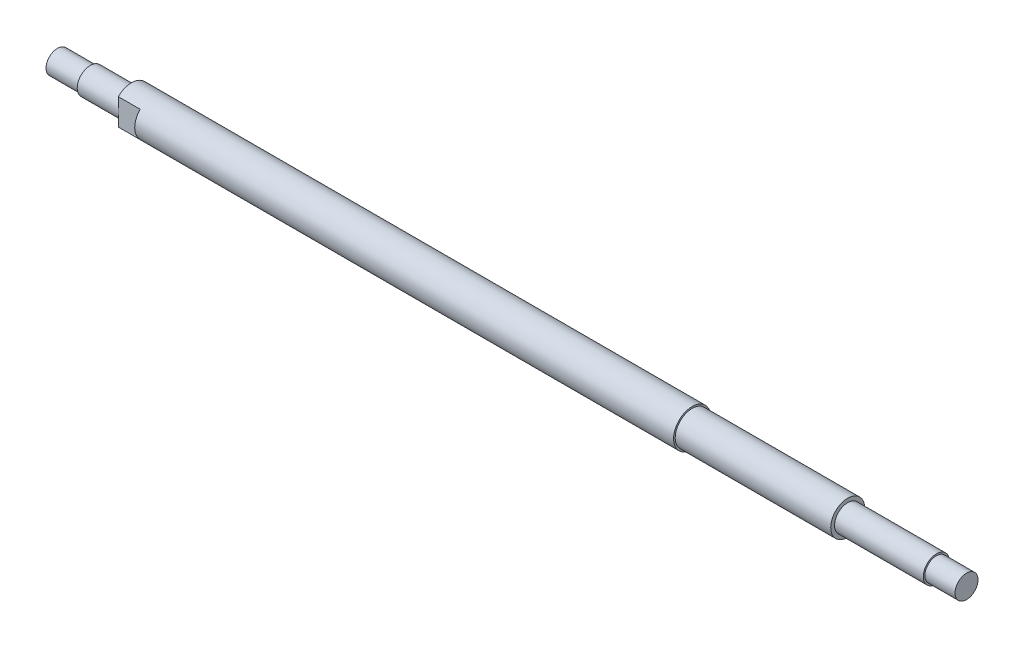
ISO-10303-21;
HEADER;
FILE_DESCRIPTION(('STEP AP214'),'2;1');
FILE_NAME('part.step','',(''),(''),'','','');
FILE_SCHEMA(('AUTOMOTIVE_DESIGN { 1 0 10303 214 1 1 1 1 }'));
ENDSEC;
DATA;
#1=APPLICATION_CONTEXT('core data for automotive mechanical design processes');
#2=APPLICATION_PROTOCOL_DEFINITION('international standard','automotive_design',2000,#1);
#3=PRODUCT_CONTEXT('',#1,'mechanical');
#4=PRODUCT('Part','Part','',(#3));
#5=PRODUCT_RELATED_PRODUCT_CATEGORY('part','',(#4));
#6=PRODUCT_DEFINITION_FORMATION('','',#4);
#7=PRODUCT_DEFINITION_CONTEXT('part definition',#1,'design');
#8=PRODUCT_DEFINITION('design','',#6,#7);
#9=PRODUCT_DEFINITION_SHAPE('','',#8);
#10=(LENGTH_UNIT() NAMED_UNIT(*) SI_UNIT(.MILLI.,.METRE.));
#11=(NAMED_UNIT(*) PLANE_ANGLE_UNIT() SI_UNIT($,.RADIAN.));
#12=(NAMED_UNIT(*) SI_UNIT($,.STERADIAN.) SOLID_ANGLE_UNIT());
#13=UNCERTAINTY_MEASURE_WITH_UNIT(LENGTH_MEASURE(1.E-05),#10,'distance_accuracy_value','');
#14=(GEOMETRIC_REPRESENTATION_CONTEXT(3) GLOBAL_UNCERTAINTY_ASSIGNED_CONTEXT((#13)) GLOBAL_UNIT_ASSIGNED_CONTEXT((#10,
#11,#12)) REPRESENTATION_CONTEXT('',''));
#15=CARTESIAN_POINT('',(0.,0.,0.));
#16=DIRECTION('',(0.,0.,1.));
#17=DIRECTION('',(1.,0.,0.));
#18=AXIS2_PLACEMENT_3D('',#15,#16,#17);
#19=CARTESIAN_POINT('',(7.5,0.,-2.4));
#20=DIRECTION('',(1.,0.,0.));
#21=DIRECTION('',(0.,0.,-1.));
#22=AXIS2_PLACEMENT_3D('',#19,#20,#21);
#23=PLANE('',#22);
#24=DIRECTION('',(0.,-1.,0.));
#25=VECTOR('',#24,1.);
#26=CARTESIAN_POINT('',(7.5,3.401,2.4));
#27=LINE('',#26,#25);
#28=CARTESIAN_POINT('',(7.5,2.40831891575846,2.4));
#29=VERTEX_POINT('',#28);
#30=CARTESIAN_POINT('',(7.5,0.,2.4));
#31=VERTEX_POINT('',#30);
#32=EDGE_CURVE('E86',#29,#31,#27,.T.);
#33=ORIENTED_EDGE('',*,*,#32,.F.);
#34=CARTESIAN_POINT('',(7.5,0.,0.));
#35=DIRECTION('',(-1.,0.,0.));
#36=DIRECTION('',(0.,0.,1.));
#37=AXIS2_PLACEMENT_3D('',#34,#35,#36);
#38=CIRCLE('',#37,3.4);
#39=CARTESIAN_POINT('',(7.5,2.40831891575846,-2.4));
#40=VERTEX_POINT('',#39);
#41=EDGE_CURVE('E108',#29,#40,#38,.T.);
#42=ORIENTED_EDGE('',*,*,#41,.T.);
#43=DIRECTION('',(0.,-1.,0.));
#44=VECTOR('',#43,1.);
#45=CARTESIAN_POINT('',(7.5,3.401,-2.4));
#46=LINE('',#45,#44);
#47=CARTESIAN_POINT('',(7.5,0.,-2.4));
#48=VERTEX_POINT('',#47);
#49=EDGE_CURVE('E138',#40,#48,#46,.T.);
#50=ORIENTED_EDGE('',*,*,#49,.T.);
#51=CARTESIAN_POINT('',(7.5,0.,0.));
#52=DIRECTION('',(-1.,0.,0.));
#53=DIRECTION('',(0.,0.,1.));
#54=AXIS2_PLACEMENT_3D('',#51,#52,#53);
#55=CIRCLE('',#54,2.4);
#56=EDGE_CURVE('E107',#31,#48,#55,.T.);
#57=ORIENTED_EDGE('',*,*,#56,.F.);
#58=EDGE_LOOP('',(#33,#42,#50,#57));
#59=FACE_BOUND('',#58,.T.);
#60=ADVANCED_FACE('F36',(#59),#23,.F.);
#61=CARTESIAN_POINT('',(7.5,-2.40831891575846,2.4));
#62=VERTEX_POINT('',#61);
#63=EDGE_CURVE('E83',#31,#62,#27,.T.);
#64=ORIENTED_EDGE('',*,*,#63,.F.);
#65=EDGE_CURVE('E110',#48,#31,#55,.T.);
#66=ORIENTED_EDGE('',*,*,#65,.F.);
#67=CARTESIAN_POINT('',(7.5,-2.40831891575846,-2.4));
#68=VERTEX_POINT('',#67);
#69=EDGE_CURVE('E106',#48,#68,#46,.T.);
#70=ORIENTED_EDGE('',*,*,#69,.T.);
#71=EDGE_CURVE('E99',#68,#62,#38,.T.);
#72=ORIENTED_EDGE('',*,*,#71,.T.);
#73=EDGE_LOOP('',(#64,#66,#70,#72));
#74=FACE_BOUND('',#73,.T.);
#75=ADVANCED_FACE('F104',(#74),#23,.F.);
#76=CARTESIAN_POINT('',(-12.2665012924017,0.,0.));
#77=DIRECTION('',(-1.,0.,0.));
#78=DIRECTION('',(0.,0.,1.));
#79=AXIS2_PLACEMENT_3D('',#76,#77,#78);
#80=CYLINDRICAL_SURFACE('',#79,3.4);
#81=CARTESIAN_POINT('',(109.9,0.,0.));
#82=DIRECTION('',(-1.,0.,0.));
#83=DIRECTION('',(0.,0.,1.));
#84=AXIS2_PLACEMENT_3D('',#81,#82,#83);
#85=CIRCLE('',#84,3.4);
#86=CARTESIAN_POINT('',(109.9,0.,3.4));
#87=VERTEX_POINT('',#86);
#88=EDGE_CURVE('E112',#87,#87,#85,.T.);
#89=ORIENTED_EDGE('',*,*,#88,.T.);
#90=EDGE_LOOP('',(#89));
#91=FACE_BOUND('',#90,.T.);
#92=DIRECTION('',(-1.,0.,0.));
#93=VECTOR('',#92,1.);
#94=CARTESIAN_POINT('',(-12.2665012924017,2.40831891575846,2.4));
#95=LINE('',#94,#93);
#96=CARTESIAN_POINT('',(11.5,2.40831891575846,2.4));
#97=VERTEX_POINT('',#96);
#98=EDGE_CURVE('E327',#29,#97,#95,.F.);
#99=ORIENTED_EDGE('',*,*,#98,.T.);
#100=CARTESIAN_POINT('',(11.5,0.,0.));
#101=DIRECTION('',(-1.,0.,0.));
#102=DIRECTION('',(0.,0.,1.));
#103=AXIS2_PLACEMENT_3D('',#100,#101,#102);
#104=CIRCLE('',#103,3.4);
#105=CARTESIAN_POINT('',(11.5,-2.40831891575846,2.4));
#106=VERTEX_POINT('',#105);
#107=EDGE_CURVE('E101',#97,#106,#104,.F.);
#108=ORIENTED_EDGE('',*,*,#107,.T.);
#109=DIRECTION('',(-1.,0.,0.));
#110=VECTOR('',#109,1.);
#111=CARTESIAN_POINT('',(-12.2665012924017,-2.40831891575846,2.4));
#112=LINE('',#111,#110);
#113=EDGE_CURVE('E51',#62,#106,#112,.F.);
#114=ORIENTED_EDGE('',*,*,#113,.F.);
#115=ORIENTED_EDGE('',*,*,#71,.F.);
#116=DIRECTION('',(-1.,0.,0.));
#117=VECTOR('',#116,1.);
#118=CARTESIAN_POINT('',(-12.2665012924017,-2.40831891575846,-2.4));
#119=LINE('',#118,#117);
#120=CARTESIAN_POINT('',(11.5,-2.40831891575846,-2.4));
#121=VERTEX_POINT('',#120);
#122=EDGE_CURVE('E139',#121,#68,#119,.T.);
#123=ORIENTED_EDGE('',*,*,#122,.F.);
#124=CARTESIAN_POINT('',(11.5,0.,0.));
#125=DIRECTION('',(-1.,0.,0.));
#126=DIRECTION('',(0.,0.,1.));
#127=AXIS2_PLACEMENT_3D('',#124,#125,#126);
#128=CIRCLE('',#127,3.4);
#129=CARTESIAN_POINT('',(11.5,2.40831891575846,-2.4));
#130=VERTEX_POINT('',#129);
#131=EDGE_CURVE('E333',#121,#130,#128,.F.);
#132=ORIENTED_EDGE('',*,*,#131,.T.);
#133=DIRECTION('',(-1.,0.,0.));
#134=VECTOR('',#133,1.);
#135=CARTESIAN_POINT('',(-12.2665012924017,2.40831891575846,-2.4));
#136=LINE('',#135,#134);
#137=EDGE_CURVE('E59',#130,#40,#136,.T.);
#138=ORIENTED_EDGE('',*,*,#137,.T.);
#139=ORIENTED_EDGE('',*,*,#41,.F.);
#140=EDGE_LOOP('',(#99,#108,#114,#115,#123,#132,#138,#139));
#141=FACE_BOUND('',#140,.T.);
#142=ADVANCED_FACE('F97',(#91,#141),#80,.T.);
#143=CARTESIAN_POINT('',(-6.,0.,-2.1));
#144=DIRECTION('',(1.,0.,0.));
#145=DIRECTION('',(0.,0.,-1.));
#146=AXIS2_PLACEMENT_3D('',#143,#144,#145);
#147=PLANE('',#146);
#148=CARTESIAN_POINT('',(-6.,0.,0.));
#149=DIRECTION('',(-1.,0.,0.));
#150=DIRECTION('',(0.,0.,1.));
#151=AXIS2_PLACEMENT_3D('',#148,#149,#150);
#152=CIRCLE('',#151,2.1);
#153=CARTESIAN_POINT('',(-6.,0.,2.1));
#154=VERTEX_POINT('',#153);
#155=EDGE_CURVE('E11',#154,#154,#152,.T.);
#156=ORIENTED_EDGE('',*,*,#155,.T.);
#157=EDGE_LOOP('',(#156));
#158=FACE_BOUND('',#157,.T.);
#159=ADVANCED_FACE('F38',(#158),#147,.F.);
#160=CARTESIAN_POINT('',(-12.2665012924017,0.,0.));
#161=DIRECTION('',(-1.,0.,0.));
#162=DIRECTION('',(0.,0.,1.));
#163=AXIS2_PLACEMENT_3D('',#160,#161,#162);
#164=CYLINDRICAL_SURFACE('',#163,2.1);
#165=ORIENTED_EDGE('',*,*,#155,.F.);
#166=EDGE_LOOP('',(#165));
#167=FACE_BOUND('',#166,.T.);
#168=CARTESIAN_POINT('',(0.,0.,0.));
#169=DIRECTION('',(-1.,0.,0.));
#170=DIRECTION('',(0.,0.,1.));
#171=AXIS2_PLACEMENT_3D('',#168,#169,#170);
#172=CIRCLE('',#171,2.1);
#173=CARTESIAN_POINT('',(0.,0.,2.1));
#174=VERTEX_POINT('',#173);
#175=EDGE_CURVE('E44',#174,#174,#172,.T.);
#176=ORIENTED_EDGE('',*,*,#175,.T.);
#177=EDGE_LOOP('',(#176));
#178=FACE_BOUND('',#177,.T.);
#179=ADVANCED_FACE('F122',(#167,#178),#164,.T.);
#180=CARTESIAN_POINT('',(0.,0.,-2.4));
#181=DIRECTION('',(1.,0.,0.));
#182=DIRECTION('',(0.,0.,-1.));
#183=AXIS2_PLACEMENT_3D('',#180,#181,#182);
#184=PLANE('',#183);
#185=ORIENTED_EDGE('',*,*,#175,.F.);
#186=EDGE_LOOP('',(#185));
#187=FACE_BOUND('',#186,.T.);
#188=CARTESIAN_POINT('',(0.,0.,0.));
#189=DIRECTION('',(-1.,0.,0.));
#190=DIRECTION('',(0.,0.,1.));
#191=AXIS2_PLACEMENT_3D('',#188,#189,#190);
#192=CIRCLE('',#191,2.4);
#193=CARTESIAN_POINT('',(0.,0.,2.4));
#194=VERTEX_POINT('',#193);
#195=EDGE_CURVE('E117',#194,#194,#192,.T.);
#196=ORIENTED_EDGE('',*,*,#195,.T.);
#197=EDGE_LOOP('',(#196));
#198=FACE_BOUND('',#197,.T.);
#199=ADVANCED_FACE('F124',(#187,#198),#184,.F.);
#200=CARTESIAN_POINT('',(-12.2665012924017,0.,0.));
#201=DIRECTION('',(-1.,0.,0.));
#202=DIRECTION('',(0.,0.,1.));
#203=AXIS2_PLACEMENT_3D('',#200,#201,#202);
#204=CYLINDRICAL_SURFACE('',#203,2.4);
#205=ORIENTED_EDGE('',*,*,#195,.F.);
#206=EDGE_LOOP('',(#205));
#207=FACE_BOUND('',#206,.T.);
#208=ORIENTED_EDGE('',*,*,#65,.T.);
#209=ORIENTED_EDGE('',*,*,#56,.T.);
#210=EDGE_LOOP('',(#208,#209));
#211=FACE_BOUND('',#210,.T.);
#212=ADVANCED_FACE('F127',(#207,#211),#204,.T.);
#213=CARTESIAN_POINT('',(109.9,0.,-3.4));
#214=DIRECTION('',(-1.,0.,0.));
#215=DIRECTION('',(0.,0.,1.));
#216=AXIS2_PLACEMENT_3D('',#213,#214,#215);
#217=PLANE('',#216);
#218=ORIENTED_EDGE('',*,*,#88,.F.);
#219=EDGE_LOOP('',(#218));
#220=FACE_BOUND('',#219,.T.);
#221=CARTESIAN_POINT('',(109.9,0.,0.));
#222=DIRECTION('',(-1.,0.,0.));
#223=DIRECTION('',(0.,0.,1.));
#224=AXIS2_PLACEMENT_3D('',#221,#222,#223);
#225=CIRCLE('',#224,3.1);
#226=CARTESIAN_POINT('',(109.9,0.,3.1));
#227=VERTEX_POINT('',#226);
#228=EDGE_CURVE('E160',#227,#227,#225,.T.);
#229=ORIENTED_EDGE('',*,*,#228,.T.);
#230=EDGE_LOOP('',(#229));
#231=FACE_BOUND('',#230,.T.);
#232=ADVANCED_FACE('F133',(#220,#231),#217,.F.);
#233=CARTESIAN_POINT('',(-12.2665012924017,0.,0.));
#234=DIRECTION('',(-1.,0.,0.));
#235=DIRECTION('',(0.,0.,1.));
#236=AXIS2_PLACEMENT_3D('',#233,#234,#235);
#237=CYLINDRICAL_SURFACE('',#236,3.1);
#238=ORIENTED_EDGE('',*,*,#228,.F.);
#239=EDGE_LOOP('',(#238));
#240=FACE_BOUND('',#239,.T.);
#241=CARTESIAN_POINT('',(138.3,0.,0.));
#242=DIRECTION('',(-1.,0.,0.));
#243=DIRECTION('',(0.,0.,1.));
#244=AXIS2_PLACEMENT_3D('',#241,#242,#243);
#245=CIRCLE('',#244,3.1);
#246=CARTESIAN_POINT('',(138.3,0.,3.1));
#247=VERTEX_POINT('',#246);
#248=EDGE_CURVE('E158',#247,#247,#245,.T.);
#249=ORIENTED_EDGE('',*,*,#248,.T.);
#250=EDGE_LOOP('',(#249));
#251=FACE_BOUND('',#250,.T.);
#252=ADVANCED_FACE('F169',(#240,#251),#237,.T.);
#253=CARTESIAN_POINT('',(138.3,0.,-3.1));
#254=DIRECTION('',(-1.,0.,0.));
#255=DIRECTION('',(0.,0.,1.));
#256=AXIS2_PLACEMENT_3D('',#253,#254,#255);
#257=PLANE('',#256);
#258=ORIENTED_EDGE('',*,*,#248,.F.);
#259=EDGE_LOOP('',(#258));
#260=FACE_BOUND('',#259,.T.);
#261=CARTESIAN_POINT('',(138.3,0.,0.));
#262=DIRECTION('',(-1.,0.,0.));
#263=DIRECTION('',(0.,0.,1.));
#264=AXIS2_PLACEMENT_3D('',#261,#262,#263);
#265=CIRCLE('',#264,2.4);
#266=CARTESIAN_POINT('',(138.3,0.,2.4));
#267=VERTEX_POINT('',#266);
#268=EDGE_CURVE('E155',#267,#267,#265,.T.);
#269=ORIENTED_EDGE('',*,*,#268,.T.);
#270=EDGE_LOOP('',(#269));
#271=FACE_BOUND('',#270,.T.);
#272=ADVANCED_FACE('F174',(#260,#271),#257,.F.);
#273=CARTESIAN_POINT('',(-12.2665012924017,0.,0.));
#274=DIRECTION('',(-1.,0.,0.));
#275=DIRECTION('',(0.,0.,1.));
#276=AXIS2_PLACEMENT_3D('',#273,#274,#275);
#277=CYLINDRICAL_SURFACE('',#276,2.4);
#278=ORIENTED_EDGE('',*,*,#268,.F.);
#279=EDGE_LOOP('',(#278));
#280=FACE_BOUND('',#279,.T.);
#281=CARTESIAN_POINT('',(154.5,0.,0.));
#282=DIRECTION('',(-1.,0.,0.));
#283=DIRECTION('',(0.,0.,1.));
#284=AXIS2_PLACEMENT_3D('',#281,#282,#283);
#285=CIRCLE('',#284,2.4);
#286=CARTESIAN_POINT('',(154.5,0.,2.4));
#287=VERTEX_POINT('',#286);
#288=EDGE_CURVE('E152',#287,#287,#285,.T.);
#289=ORIENTED_EDGE('',*,*,#288,.T.);
#290=EDGE_LOOP('',(#289));
#291=FACE_BOUND('',#290,.T.);
#292=ADVANCED_FACE('F238',(#280,#291),#277,.T.);
#293=CARTESIAN_POINT('',(154.5,0.,-2.4));
#294=DIRECTION('',(-1.,0.,0.));
#295=DIRECTION('',(0.,0.,1.));
#296=AXIS2_PLACEMENT_3D('',#293,#294,#295);
#297=PLANE('',#296);
#298=ORIENTED_EDGE('',*,*,#288,.F.);
#299=EDGE_LOOP('',(#298));
#300=FACE_BOUND('',#299,.T.);
#301=CARTESIAN_POINT('',(154.5,0.,0.));
#302=DIRECTION('',(-1.,0.,0.));
#303=DIRECTION('',(0.,0.,1.));
#304=AXIS2_PLACEMENT_3D('',#301,#302,#303);
#305=CIRCLE('',#304,2.1);
#306=CARTESIAN_POINT('',(154.5,0.,2.1));
#307=VERTEX_POINT('',#306);
#308=EDGE_CURVE('E145',#307,#307,#305,.T.);
#309=ORIENTED_EDGE('',*,*,#308,.T.);
#310=EDGE_LOOP('',(#309));
#311=FACE_BOUND('',#310,.T.);
#312=ADVANCED_FACE('F227',(#300,#311),#297,.F.);
#313=CARTESIAN_POINT('',(-12.2665012924017,0.,0.));
#314=DIRECTION('',(-1.,0.,0.));
#315=DIRECTION('',(0.,0.,1.));
#316=AXIS2_PLACEMENT_3D('',#313,#314,#315);
#317=CYLINDRICAL_SURFACE('',#316,2.1);
#318=ORIENTED_EDGE('',*,*,#308,.F.);
#319=EDGE_LOOP('',(#318));
#320=FACE_BOUND('',#319,.T.);
#321=CARTESIAN_POINT('',(160.,0.,0.));
#322=DIRECTION('',(-1.,0.,0.));
#323=DIRECTION('',(0.,0.,1.));
#324=AXIS2_PLACEMENT_3D('',#321,#322,#323);
#325=CIRCLE('',#324,2.1);
#326=CARTESIAN_POINT('',(160.,0.,2.1));
#327=VERTEX_POINT('',#326);
#328=EDGE_CURVE('E143',#327,#327,#325,.T.);
#329=ORIENTED_EDGE('',*,*,#328,.T.);
#330=EDGE_LOOP('',(#329));
#331=FACE_BOUND('',#330,.T.);
#332=ADVANCED_FACE('F215',(#320,#331),#317,.T.);
#333=CARTESIAN_POINT('',(160.,0.,-2.1));
#334=DIRECTION('',(-1.,0.,0.));
#335=DIRECTION('',(0.,0.,1.));
#336=AXIS2_PLACEMENT_3D('',#333,#334,#335);
#337=PLANE('',#336);
#338=ORIENTED_EDGE('',*,*,#328,.F.);
#339=EDGE_LOOP('',(#338));
#340=FACE_BOUND('',#339,.T.);
#341=ADVANCED_FACE('F210',(#340),#337,.F.);
#342=CARTESIAN_POINT('',(7.5,3.401,-2.4));
#343=DIRECTION('',(0.,0.,-1.));
#344=DIRECTION('',(-1.,0.,0.));
#345=AXIS2_PLACEMENT_3D('',#342,#343,#344);
#346=PLANE('',#345);
#347=DIRECTION('',(0.,-1.,0.));
#348=VECTOR('',#347,1.);
#349=CARTESIAN_POINT('',(11.5,3.401,-2.4));
#350=LINE('',#349,#348);
#351=EDGE_CURVE('E140',#130,#121,#350,.T.);
#352=ORIENTED_EDGE('',*,*,#351,.T.);
#353=ORIENTED_EDGE('',*,*,#122,.T.);
#354=ORIENTED_EDGE('',*,*,#69,.F.);
#355=ORIENTED_EDGE('',*,*,#49,.F.);
#356=ORIENTED_EDGE('',*,*,#137,.F.);
#357=EDGE_LOOP('',(#352,#353,#354,#355,#356));
#358=FACE_BOUND('',#357,.T.);
#359=ADVANCED_FACE('F137',(#358),#346,.T.);
#360=CARTESIAN_POINT('',(11.5,3.401,-2.4));
#361=DIRECTION('',(-1.,0.,0.));
#362=DIRECTION('',(0.,0.,1.));
#363=AXIS2_PLACEMENT_3D('',#360,#361,#362);
#364=PLANE('',#363);
#365=ORIENTED_EDGE('',*,*,#351,.F.);
#366=ORIENTED_EDGE('',*,*,#131,.F.);
#367=EDGE_LOOP('',(#365,#366));
#368=FACE_BOUND('',#367,.T.);
#369=ADVANCED_FACE('F296',(#368),#364,.T.);
#370=CARTESIAN_POINT('',(7.5,3.401,2.4));
#371=DIRECTION('',(0.,0.,1.));
#372=DIRECTION('',(1.,0.,0.));
#373=AXIS2_PLACEMENT_3D('',#370,#371,#372);
#374=PLANE('',#373);
#375=ORIENTED_EDGE('',*,*,#32,.T.);
#376=ORIENTED_EDGE('',*,*,#63,.T.);
#377=ORIENTED_EDGE('',*,*,#113,.T.);
#378=DIRECTION('',(0.,-1.,0.));
#379=VECTOR('',#378,1.);
#380=CARTESIAN_POINT('',(11.5,3.401,2.4));
#381=LINE('',#380,#379);
#382=EDGE_CURVE('E91',#97,#106,#381,.T.);
#383=ORIENTED_EDGE('',*,*,#382,.F.);
#384=ORIENTED_EDGE('',*,*,#98,.F.);
#385=EDGE_LOOP('',(#375,#376,#377,#383,#384));
#386=FACE_BOUND('',#385,.T.);
#387=ADVANCED_FACE('F84',(#386),#374,.T.);
#388=CARTESIAN_POINT('',(11.5,3.401,2.4));
#389=DIRECTION('',(-1.,0.,0.));
#390=DIRECTION('',(0.,0.,1.));
#391=AXIS2_PLACEMENT_3D('',#388,#389,#390);
#392=PLANE('',#391);
#393=ORIENTED_EDGE('',*,*,#382,.T.);
#394=ORIENTED_EDGE('',*,*,#107,.F.);
#395=EDGE_LOOP('',(#393,#394));
#396=FACE_BOUND('',#395,.T.);
#397=ADVANCED_FACE('F314',(#396),#392,.T.);
#398=CLOSED_SHELL('',(#60,#75,#142,#159,#179,#199,#212,#232,#252,#272,#292,#312,#332,#341,#359,
#369,#387,#397));
#399=MANIFOLD_SOLID_BREP('B2',#398);
#400=ADVANCED_BREP_SHAPE_REPRESENTATION('',(#18,#399),#14);
#401=SHAPE_DEFINITION_REPRESENTATION(#9,#400);
ENDSEC;
END-ISO-10303-21;
